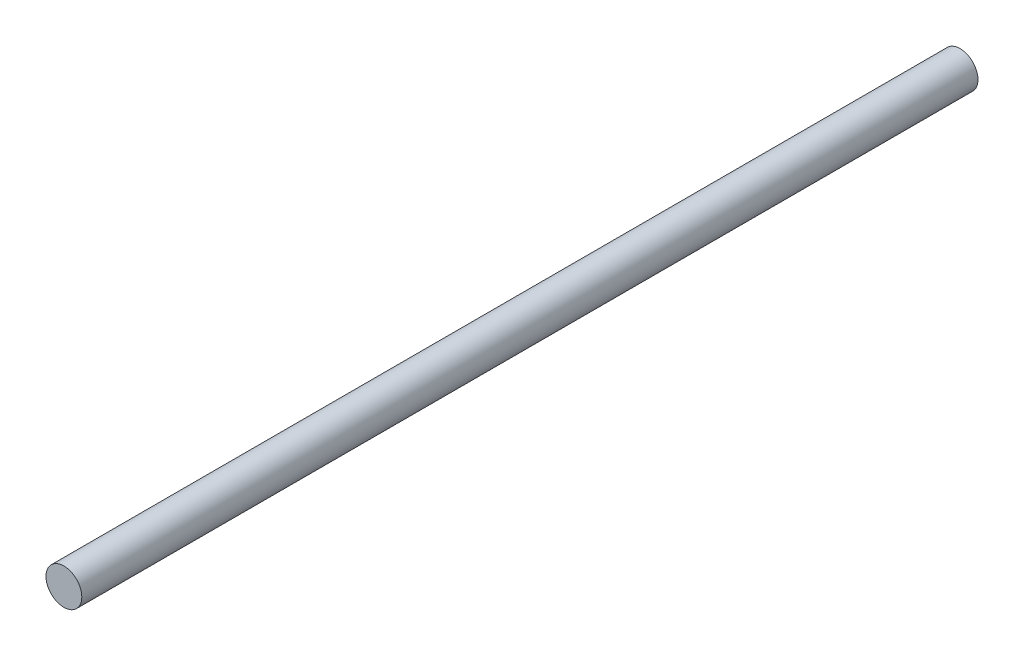
ISO-10303-21;
HEADER;
FILE_DESCRIPTION(('STEP AP214'),'2;1');
FILE_NAME('part.step','',(''),(''),'','','');
FILE_SCHEMA(('AUTOMOTIVE_DESIGN { 1 0 10303 214 1 1 1 1 }'));
ENDSEC;
DATA;
#1=APPLICATION_CONTEXT('core data for automotive mechanical design processes');
#2=APPLICATION_PROTOCOL_DEFINITION('international standard','automotive_design',2000,#1);
#3=PRODUCT_CONTEXT('',#1,'mechanical');
#4=PRODUCT('Part','Part','',(#3));
#5=PRODUCT_RELATED_PRODUCT_CATEGORY('part','',(#4));
#6=PRODUCT_DEFINITION_FORMATION('','',#4);
#7=PRODUCT_DEFINITION_CONTEXT('part definition',#1,'design');
#8=PRODUCT_DEFINITION('design','',#6,#7);
#9=PRODUCT_DEFINITION_SHAPE('','',#8);
#10=(LENGTH_UNIT() NAMED_UNIT(*) SI_UNIT(.MILLI.,.METRE.));
#11=(NAMED_UNIT(*) PLANE_ANGLE_UNIT() SI_UNIT($,.RADIAN.));
#12=(NAMED_UNIT(*) SI_UNIT($,.STERADIAN.) SOLID_ANGLE_UNIT());
#13=UNCERTAINTY_MEASURE_WITH_UNIT(LENGTH_MEASURE(1.E-05),#10,'distance_accuracy_value','');
#14=(GEOMETRIC_REPRESENTATION_CONTEXT(3) GLOBAL_UNCERTAINTY_ASSIGNED_CONTEXT((#13)) GLOBAL_UNIT_ASSIGNED_CONTEXT((#10,
#11,#12)) REPRESENTATION_CONTEXT('',''));
#15=CARTESIAN_POINT('',(0.,0.,0.));
#16=DIRECTION('',(0.,0.,1.));
#17=DIRECTION('',(1.,0.,0.));
#18=AXIS2_PLACEMENT_3D('',#15,#16,#17);
#19=CARTESIAN_POINT('',(0.,0.,400.));
#20=DIRECTION('',(0.,0.,-1.));
#21=DIRECTION('',(-1.,0.,0.));
#22=AXIS2_PLACEMENT_3D('',#19,#20,#21);
#23=CYLINDRICAL_SURFACE('',#22,8.);
#24=CARTESIAN_POINT('',(0.,0.,400.));
#25=DIRECTION('',(0.,0.,1.));
#26=DIRECTION('',(1.,0.,0.));
#27=AXIS2_PLACEMENT_3D('',#24,#25,#26);
#28=CIRCLE('',#27,8.);
#29=CARTESIAN_POINT('',(8.,0.,400.));
#30=VERTEX_POINT('',#29);
#31=EDGE_CURVE('E12',#30,#30,#28,.T.);
#32=ORIENTED_EDGE('',*,*,#31,.F.);
#33=EDGE_LOOP('',(#32));
#34=FACE_BOUND('',#33,.T.);
#35=CARTESIAN_POINT('',(0.,0.,0.));
#36=DIRECTION('',(0.,0.,1.));
#37=DIRECTION('',(1.,0.,0.));
#38=AXIS2_PLACEMENT_3D('',#35,#36,#37);
#39=CIRCLE('',#38,8.);
#40=CARTESIAN_POINT('',(8.,0.,0.));
#41=VERTEX_POINT('',#40);
#42=EDGE_CURVE('E43',#41,#41,#39,.T.);
#43=ORIENTED_EDGE('',*,*,#42,.T.);
#44=EDGE_LOOP('',(#43));
#45=FACE_BOUND('',#44,.T.);
#46=ADVANCED_FACE('F40',(#34,#45),#23,.T.);
#47=CARTESIAN_POINT('',(0.,0.,400.));
#48=DIRECTION('',(0.,0.,1.));
#49=DIRECTION('',(1.,0.,0.));
#50=AXIS2_PLACEMENT_3D('',#47,#48,#49);
#51=PLANE('',#50);
#52=ORIENTED_EDGE('',*,*,#31,.T.);
#53=EDGE_LOOP('',(#52));
#54=FACE_BOUND('',#53,.T.);
#55=ADVANCED_FACE('F55',(#54),#51,.T.);
#56=CARTESIAN_POINT('',(0.,0.,0.));
#57=DIRECTION('',(0.,0.,1.));
#58=DIRECTION('',(1.,0.,0.));
#59=AXIS2_PLACEMENT_3D('',#56,#57,#58);
#60=PLANE('',#59);
#61=ORIENTED_EDGE('',*,*,#42,.F.);
#62=EDGE_LOOP('',(#61));
#63=FACE_BOUND('',#62,.T.);
#64=ADVANCED_FACE('F53',(#63),#60,.F.);
#65=CLOSED_SHELL('',(#46,#55,#64));
#66=MANIFOLD_SOLID_BREP('B2',#65);
#67=ADVANCED_BREP_SHAPE_REPRESENTATION('',(#18,#66),#14);
#68=SHAPE_DEFINITION_REPRESENTATION(#9,#67);
ENDSEC;
END-ISO-10303-21;
